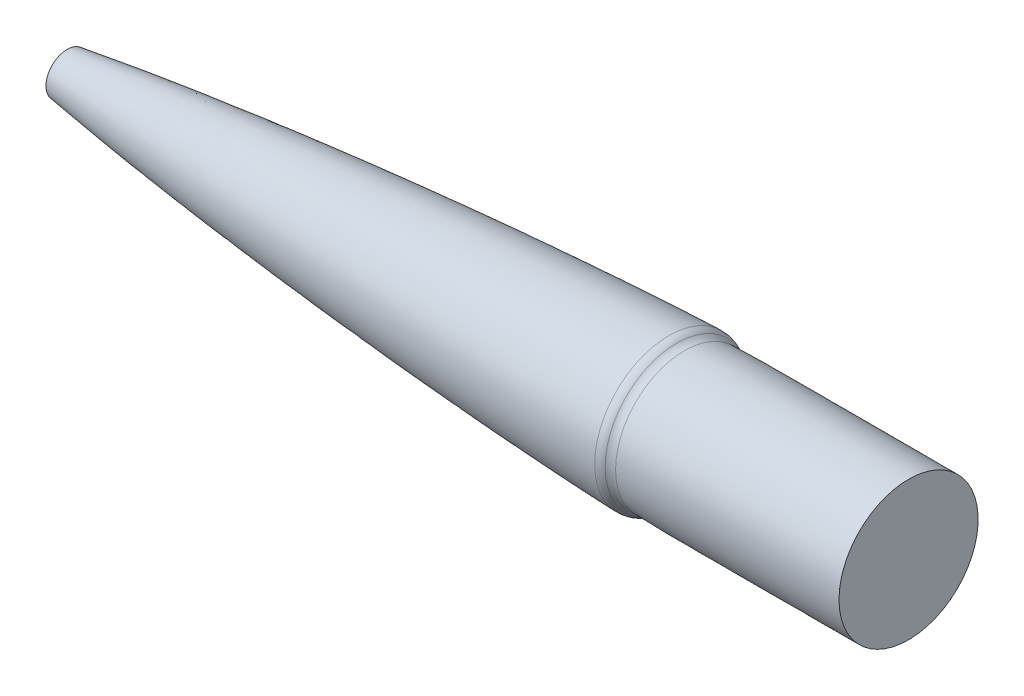
ISO-10303-21;
HEADER;
FILE_DESCRIPTION(('STEP AP214'),'2;1');
FILE_NAME('part.step','',(''),(''),'','','');
FILE_SCHEMA(('AUTOMOTIVE_DESIGN { 1 0 10303 214 1 1 1 1 }'));
ENDSEC;
DATA;
#1=APPLICATION_CONTEXT('core data for automotive mechanical design processes');
#2=APPLICATION_PROTOCOL_DEFINITION('international standard','automotive_design',2000,#1);
#3=PRODUCT_CONTEXT('',#1,'mechanical');
#4=PRODUCT('Part','Part','',(#3));
#5=PRODUCT_RELATED_PRODUCT_CATEGORY('part','',(#4));
#6=PRODUCT_DEFINITION_FORMATION('','',#4);
#7=PRODUCT_DEFINITION_CONTEXT('part definition',#1,'design');
#8=PRODUCT_DEFINITION('design','',#6,#7);
#9=PRODUCT_DEFINITION_SHAPE('','',#8);
#10=(LENGTH_UNIT() NAMED_UNIT(*) SI_UNIT(.MILLI.,.METRE.));
#11=(NAMED_UNIT(*) PLANE_ANGLE_UNIT() SI_UNIT($,.RADIAN.));
#12=(NAMED_UNIT(*) SI_UNIT($,.STERADIAN.) SOLID_ANGLE_UNIT());
#13=UNCERTAINTY_MEASURE_WITH_UNIT(LENGTH_MEASURE(1.E-05),#10,'distance_accuracy_value','');
#14=(GEOMETRIC_REPRESENTATION_CONTEXT(3) GLOBAL_UNCERTAINTY_ASSIGNED_CONTEXT((#13)) GLOBAL_UNIT_ASSIGNED_CONTEXT((#10,
#11,#12)) REPRESENTATION_CONTEXT('',''));
#15=CARTESIAN_POINT('',(0.,0.,0.));
#16=DIRECTION('',(0.,0.,1.));
#17=DIRECTION('',(1.,0.,0.));
#18=AXIS2_PLACEMENT_3D('',#15,#16,#17);
#19=CARTESIAN_POINT('',(4.83268455642582,0.,6.60552318193741));
#20=CARTESIAN_POINT('',(4.83749972097028,0.,6.60285947370063));
#21=CARTESIAN_POINT('',(4.82681383787675,0.,6.60876016188589));
#22=CARTESIAN_POINT('',(4.83801886693308,0.,6.60257668329158));
#23=CARTESIAN_POINT('',(4.83250618312896,0.,6.60561165797518));
#24=CARTESIAN_POINT('',(4.8399846110203,0.,6.60150461279268));
#25=CARTESIAN_POINT('',(4.83520410508804,0.,6.60412357297985));
#26=CARTESIAN_POINT('',(4.8464347391894,0.,6.59798672188499));
#27=CARTESIAN_POINT('',(4.83896554863311,0.,6.60204769683206));
#28=CARTESIAN_POINT('',(4.8539759734831,0.,6.59393191213478));
#29=CARTESIAN_POINT('',(4.84911899118824,0.,6.59654394521379));
#30=CARTESIAN_POINT('',(4.8641679427654,0.,6.58849982488547));
#31=CARTESIAN_POINT('',(4.86170750840961,0.,6.58980766712842));
#32=CARTESIAN_POINT('',(4.87679746030247,0.,6.58184072497347));
#33=CARTESIAN_POINT('',(4.87651514125029,0.,6.58198934907074));
#34=CARTESIAN_POINT('',(4.89921559976168,0.,6.57016388848399));
#35=CARTESIAN_POINT('',(4.90432341538071,0.,6.56755835116335));
#36=CARTESIAN_POINT('',(4.93475704207706,0.,6.55211459424268));
#37=CARTESIAN_POINT('',(4.94623689867739,0.,6.54635949091499));
#38=CARTESIAN_POINT('',(4.97679775161726,0.,6.53116904887707));
#39=CARTESIAN_POINT('',(4.99342554287252,0.,6.52298709115691));
#40=CARTESIAN_POINT('',(5.02409890874871,0.,6.50802514317069));
#41=CARTESIAN_POINT('',(5.044659359757,0.,6.49809059549946));
#42=CARTESIAN_POINT('',(5.07544018073853,0.,6.48335097808854));
#43=CARTESIAN_POINT('',(5.09885600542887,0.,6.47223965954034));
#44=CARTESIAN_POINT('',(5.12973367847781,0.,6.45770402853244));
#45=CARTESIAN_POINT('',(5.15537548823818,0.,6.44572972430582));
#46=CARTESIAN_POINT('',(5.18633782369174,0.,6.43137531575032));
#47=CARTESIAN_POINT('',(5.21368121334199,0.,6.41879007529082));
#48=CARTESIAN_POINT('',(5.2447189993178,0.,6.40459954663838));
#49=CARTESIAN_POINT('',(5.27324287392851,0.,6.39164454267426));
#50=CARTESIAN_POINT('',(5.30434899961548,0.,6.37760444985172));
#51=CARTESIAN_POINT('',(5.33354110646858,0.,6.36450914158684));
#52=CARTESIAN_POINT('',(5.36470997323617,0.,6.35060888956967));
#53=CARTESIAN_POINT('',(5.39407170494003,0.,6.33759006005425));
#54=CARTESIAN_POINT('',(5.42529881638663,0.,6.32382115405486));
#55=CARTESIAN_POINT('',(5.45434932394373,0.,6.31108198351092));
#56=CARTESIAN_POINT('',(5.4856309908471,0.,6.29743747628402));
#57=CARTESIAN_POINT('',(5.51391283997896,0.,6.28516624393363));
#58=CARTESIAN_POINT('',(5.54524547882567,0.,6.27163919678282));
#59=CARTESIAN_POINT('',(5.57247956278986,0.,6.25993673000104));
#60=CARTESIAN_POINT('',(5.60385711349994,0.,6.24651419025795));
#61=CARTESIAN_POINT('',(5.62995741615585,0.,6.23539740715504));
#62=CARTESIAN_POINT('',(5.66137589888544,0.,6.22207095959049));
#63=CARTESIAN_POINT('',(5.68627456092169,0.,6.21155229874281));
#64=CARTESIAN_POINT('',(5.71773058102512,0.,6.19831469847049));
#65=CARTESIAN_POINT('',(5.74138407559505,0.,6.18839781700479));
#66=CARTESIAN_POINT('',(5.77287471729874,0.,6.17524278957005));
#67=CARTESIAN_POINT('',(5.79526099537225,0.,6.16592377046405));
#68=CARTESIAN_POINT('',(5.84254511111652,0.,6.14630689667781));
#69=CARTESIAN_POINT('',(5.88352104666606,0.,6.129417198479));
#70=CARTESIAN_POINT('',(5.94668237522017,0.,6.10354235312387));
#71=CARTESIAN_POINT('',(5.98275550140594,0.,6.08885040636339));
#72=CARTESIAN_POINT('',(6.04601925522565,0.,6.0632270088621));
#73=CARTESIAN_POINT('',(6.07756403840755,0.,6.05051854445484));
#74=CARTESIAN_POINT('',(6.14091959540364,0.,6.02512298491023));
#75=CARTESIAN_POINT('',(6.16860262808675,0.,6.01408022182471));
#76=CARTESIAN_POINT('',(6.23204044160335,0.,5.98889084185814));
#77=CARTESIAN_POINT('',(6.25663256825075,0.,5.9791696817537));
#78=CARTESIAN_POINT('',(6.32014522146024,0.,5.9541696031706));
#79=CARTESIAN_POINT('',(6.34245362414577,0.,5.94542518684871));
#80=CARTESIAN_POINT('',(6.40603523176033,0.,5.92060100065827));
#81=CARTESIAN_POINT('',(6.42692097790816,0.,5.91247878693595));
#82=CARTESIAN_POINT('',(6.49056694962166,0.,5.88782009006219));
#83=CARTESIAN_POINT('',(6.51093672045816,0.,5.87995795236834));
#84=CARTESIAN_POINT('',(6.57464357246575,0.,5.85545697169104));
#85=CARTESIAN_POINT('',(6.59544319499273,0.,5.84748694072378));
#86=CARTESIAN_POINT('',(6.65920839624904,0.,5.82313822092973));
#87=CARTESIAN_POINT('',(6.6814162495825,0.,5.81468870758096));
#88=CARTESIAN_POINT('',(6.74523798919747,0.,5.79048857123038));
#89=CARTESIAN_POINT('',(6.76951825878803,0.,5.78131417164714));
#90=CARTESIAN_POINT('',(6.83339493947841,0.,5.75725942760681));
#91=CARTESIAN_POINT('',(6.8596734214108,0.,5.74739783947368));
#92=CARTESIAN_POINT('',(6.95556932930949,0.,5.71153125051222));
#93=CARTESIAN_POINT('',(7.01340753174464,0.,5.69004886411442));
#94=CARTESIAN_POINT('',(7.1414775821322,0.,5.6427888770091));
#95=CARTESIAN_POINT('',(7.20510392805037,0.,5.6194676051386));
#96=CARTESIAN_POINT('',(7.33337270115734,0.,5.57274966390496));
#97=CARTESIAN_POINT('',(7.4012029669081,0.,5.54820463008454));
#98=CARTESIAN_POINT('',(7.59388780681527,0.,5.47890598730019));
#99=CARTESIAN_POINT('',(7.73543883749296,0.,5.42862731186892));
#100=CARTESIAN_POINT('',(7.99303402975234,0.,5.33814806742735));
#101=CARTESIAN_POINT('',(8.13136793124169,0.,5.29009625338913));
#102=CARTESIAN_POINT('',(8.38955131631159,0.,5.20130933755284));
#103=CARTESIAN_POINT('',(8.52061198204528,0.,5.15668382125682));
#104=CARTESIAN_POINT('',(8.90865202682184,0.,5.02574902321967));
#105=CARTESIAN_POINT('',(9.16165698677185,0.,4.94190576947565));
#106=CARTESIAN_POINT('',(9.94029019567608,0.,4.687728042795));
#107=CARTESIAN_POINT('',(10.4608949378079,0.,4.52278983098063));
#108=CARTESIAN_POINT('',(13.0694093427846,0.,3.71666932260896));
#109=CARTESIAN_POINT('',(15.1730596457674,0.,3.12787826699114));
#110=CARTESIAN_POINT('',(21.5041419916135,0.,1.43865959019151));
#111=CARTESIAN_POINT('',(25.7532051724552,0.,0.421026181929159));
#112=CARTESIAN_POINT('',(34.2726824192563,0.,-1.51528134352232));
#113=CARTESIAN_POINT('',(38.5448966370535,0.,-2.42798670810905));
#114=CARTESIAN_POINT('',(47.1027601183387,0.,-4.18689319441429));
#115=CARTESIAN_POINT('',(51.3889242671881,0.,-5.0309718203088));
#116=CARTESIAN_POINT('',(64.2617852835467,0.,-7.48733150188042));
#117=CARTESIAN_POINT('',(72.8629142375998,0.,-9.02313024476923));
#118=CARTESIAN_POINT('',(90.0864300781289,0.,-11.9682312037464));
#119=CARTESIAN_POINT('',(98.7095200342393,0.,-13.3741187408272));
#120=CARTESIAN_POINT('',(124.601188031838,0.,-17.4482496701259));
#121=CARTESIAN_POINT('',(141.891817456551,0.,-19.9748151700434));
#122=CARTESIAN_POINT('',(176.507305156509,0.,-24.7769481923739));
#123=CARTESIAN_POINT('',(193.832729026664,0.,-27.049800159208));
#124=CARTESIAN_POINT('',(245.845180778652,0.,-33.5776574535152));
#125=CARTESIAN_POINT('',(280.56798660515,0.,-37.5442567701871));
#126=CARTESIAN_POINT('',(350.07183031062,0.,-44.9189154908417));
#127=CARTESIAN_POINT('',(384.853733718803,0.,-48.3222362982757));
#128=CARTESIAN_POINT('',(454.461735096074,0.,-54.6385663515796));
#129=CARTESIAN_POINT('',(489.288073765698,0.,-57.5503387899058));
#130=CARTESIAN_POINT('',(558.97765835012,0.,-62.8918443390221));
#131=CARTESIAN_POINT('',(593.840989824159,0.,-65.321984906555));
#132=CARTESIAN_POINT('',(663.601030955245,0.,-69.6470909711167));
#133=CARTESIAN_POINT('',(698.49775323348,0.,-71.5473308312863));
#134=CARTESIAN_POINT('',(750.867293771161,0.,-73.858019468879));
#135=CARTESIAN_POINT('',(768.327894946954,0.,-74.5383123540745));
#136=CARTESIAN_POINT('',(786.330846217041,0.,-75.1061683142761));
#137=CARTESIAN_POINT('',(786.868989785362,0.,-75.1230203611017));
#138=CARTESIAN_POINT('',(787.407137336109,0.,-75.1397468610843));
#139=CARTESIAN_POINT('',(789.769222398439,0.,-75.2131643015221));
#140=CARTESIAN_POINT('',(794.493542884528,0.,-75.3551615513797));
#141=CARTESIAN_POINT('',(801.580357780933,0.,-75.5584829979889));
#142=CARTESIAN_POINT('',(806.30534090121,0.,-75.6762894582134));
#143=CARTESIAN_POINT('',(808.667832461347,0.,-75.7351926883257));
#144=CARTESIAN_POINT('',(812.810288023743,0.,-75.8384751792936));
#145=CARTESIAN_POINT('',(821.095199148533,0.,-76.0450401612293));
#146=CARTESIAN_POINT('',(833.527393301713,0.,-76.2));
#147=CARTESIAN_POINT('',(841.814879135031,0.,-76.2));
#148=CARTESIAN_POINT('',(845.95862205169,0.,-76.2));
#149=CARTESIAN_POINT('',(850.74099737928,0.,-76.2));
#150=CARTESIAN_POINT('',(860.30574803446,0.,-76.2));
#151=CARTESIAN_POINT('',(874.65287401723,0.,-76.2));
#152=CARTESIAN_POINT('',(884.21762467241,0.,-76.2));
#153=CARTESIAN_POINT('',(889.,0.,-76.2));
#154=CARTESIAN_POINT('',(939.8,0.,-76.2));
#155=CARTESIAN_POINT('',(990.6,0.,-76.2));
#156=CARTESIAN_POINT('',(1041.4,0.,-76.2));
#157=B_SPLINE_CURVE_WITH_KNOTS('',3,(#19,#20,#21,#22,#23,#24,#25,#26,#27,#28,#29,#30,#31,#32,
#33,#34,#35,#36,#37,#38,#39,#40,#41,#42,#43,#44,#45,#46,#47,#48,#49,#50,#51,#52,#53,#54,#55,#56,
#57,#58,#59,#60,#61,#62,#63,#64,#65,#66,#67,#68,#69,#70,#71,#72,#73,#74,#75,#76,#77,#78,#79,#80,
#81,#82,#83,#84,#85,#86,#87,#88,#89,#90,#91,#92,#93,#94,#95,#96,#97,#98,#99,#100,#101,#102,#103,
#104,#105,#106,#107,#108,#109,#110,#111,#112,#113,#114,#115,#116,#117,#118,#119,#120,#121,#122,
#123,#124,#125,#126,#127,#128,#129,#130,#131,#132,#133,#134,#135,#136,#137,#138,#139,#140,#141,
#142,#143,#144,#145,#146,#147,#148,#149,#150,#151,#152,#153,#154,#155,#156),.UNSPECIFIED.,.F.,
.F.,(4,2,2,2,2,2,2,2,2,2,2,2,2,2,2,2,2,2,2,2,2,2,2,2,2,2,2,2,2,2,2,2,2,2,2,2,2,2,2,2,2,2,2,2,2,
2,2,2,2,2,2,2,2,2,2,2,2,2,2,3,1,1,3,1,1,3,1,1,3,4),(0.,2.45659755341227E-05,
3.68489633011841E-05,4.91319510682454E-05,7.36979266023682E-05,9.82639021364909E-05,
0.000122829877670614,0.000147395853204736,0.000196527804272982,0.000245659755341227,
0.000294791706409473,0.000343923657477718,0.000393055608545963,0.000442187559614209,
0.000491319510682454,0.0005404514617507,0.000589583412818945,0.000638715363887191,
0.000687847314955436,0.000736979266023681,0.000786111217091927,0.000835243168160172,
0.000884375119228418,0.000933507070296663,0.000982639021364909,0.0010809029235014,
0.00117916682563789,0.00127743072777438,0.00137569462991087,0.00147395853204736,
0.00157222243418385,0.00167048633632034,0.00176875023845684,0.00186701414059333,
0.00196527804272982,0.00206354194486631,0.0021618058470028,0.00235833365127578,
0.00255486145554876,0.00275138925982174,0.00314444486836771,0.00353750047691367,
0.00393055608545964,0.00471666730255156,0.00628888973673541,0.0125777794734708,
0.0251555589469417,0.0377333384204125,0.0503111178938833,0.075466676840825,0.100622235787767,
0.15093335368165,0.201244471575533,0.3018667073633,0.402488943151067,0.503111178938833,
0.6037334147266,0.704355650514367,0.75466676840825,0.756216994376473,0.763021383986146,
0.769825773595819,0.776630163205491,0.788561160997351,0.80049215878921,0.812423156581069,
0.826192956161041,0.839962755741013,0.853732555320985,1.),.UNSPECIFIED.);
#158=CARTESIAN_POINT('',(0.,0.,0.));
#159=DIRECTION('',(-1.,0.,0.));
#160=AXIS1_PLACEMENT('',#158,#159);
#161=SURFACE_OF_REVOLUTION('',#157,#160);
#162=CARTESIAN_POINT('',(1041.4,0.,0.));
#163=DIRECTION('',(-1.,0.,0.));
#164=DIRECTION('',(0.,0.,1.));
#165=AXIS2_PLACEMENT_3D('',#162,#163,#164);
#166=CIRCLE('',#165,76.2);
#167=CARTESIAN_POINT('',(1041.4,0.,76.2));
#168=VERTEX_POINT('',#167);
#169=EDGE_CURVE('E53',#168,#168,#166,.T.);
#170=ORIENTED_EDGE('',*,*,#169,.T.);
#171=EDGE_LOOP('',(#170));
#172=FACE_BOUND('',#171,.T.);
#173=CARTESIAN_POINT('',(795.868589895676,0.,0.));
#174=DIRECTION('',(-1.,0.,0.));
#175=DIRECTION('',(0.,0.,1.));
#176=AXIS2_PLACEMENT_3D('',#173,#174,#175);
#177=CIRCLE('',#176,75.3937343472756);
#178=CARTESIAN_POINT('',(795.868589895676,0.,75.3937343472756));
#179=VERTEX_POINT('',#178);
#180=EDGE_CURVE('E10',#179,#179,#177,.T.);
#181=ORIENTED_EDGE('',*,*,#180,.F.);
#182=EDGE_LOOP('',(#181));
#183=FACE_BOUND('',#182,.T.);
#184=ADVANCED_FACE('F33',(#172,#183),#161,.F.);
#185=CARTESIAN_POINT('',(795.499642950915,0.,0.));
#186=DIRECTION('',(-1.,0.,0.));
#187=DIRECTION('',(0.,0.,1.));
#188=AXIS2_PLACEMENT_3D('',#185,#186,#187);
#189=TOROIDAL_SURFACE('',#188,88.0883740882039,12.7000000000002);
#190=CARTESIAN_POINT('',(787.4,0.,0.));
#191=DIRECTION('',(-1.,0.,0.));
#192=DIRECTION('',(0.,0.,1.));
#193=AXIS2_PLACEMENT_3D('',#190,#191,#192);
#194=CIRCLE('',#193,78.3064630240148);
#195=CARTESIAN_POINT('',(787.4,0.,78.3064630240148));
#196=VERTEX_POINT('',#195);
#197=EDGE_CURVE('E40',#196,#196,#194,.T.);
#198=ORIENTED_EDGE('',*,*,#197,.F.);
#199=EDGE_LOOP('',(#198));
#200=FACE_BOUND('',#199,.T.);
#201=ORIENTED_EDGE('',*,*,#180,.T.);
#202=EDGE_LOOP('',(#201));
#203=FACE_BOUND('',#202,.T.);
#204=ADVANCED_FACE('F75',(#200,#203),#189,.F.);
#205=CARTESIAN_POINT('',(779.300357049086,0.,0.));
#206=DIRECTION('',(-1.,0.,0.));
#207=DIRECTION('',(0.,0.,1.));
#208=AXIS2_PLACEMENT_3D('',#205,#206,#207);
#209=TOROIDAL_SURFACE('',#208,68.5245519598254,12.7000000000002);
#210=ORIENTED_EDGE('',*,*,#197,.T.);
#211=EDGE_LOOP('',(#210));
#212=FACE_BOUND('',#211,.T.);
#213=CARTESIAN_POINT('',(778.875735907474,0.,0.));
#214=DIRECTION('',(-1.,0.,0.));
#215=DIRECTION('',(0.,0.,1.));
#216=AXIS2_PLACEMENT_3D('',#213,#214,#215);
#217=CIRCLE('',#216,81.2174514270906);
#218=CARTESIAN_POINT('',(778.875735907474,0.,81.2174514270906));
#219=VERTEX_POINT('',#218);
#220=EDGE_CURVE('E44',#219,#219,#217,.T.);
#221=ORIENTED_EDGE('',*,*,#220,.F.);
#222=EDGE_LOOP('',(#221));
#223=FACE_BOUND('',#222,.T.);
#224=ADVANCED_FACE('F71',(#212,#223),#209,.T.);
#225=CARTESIAN_POINT('',(1.45244842624921,0.,1.23264697666696));
#226=CARTESIAN_POINT('',(1.52882645439852,0.,1.18155010634796));
#227=CARTESIAN_POINT('',(1.67309054241462,0.,1.09479404995592));
#228=CARTESIAN_POINT('',(2.07893103489429,0.,0.875013099928082));
#229=CARTESIAN_POINT('',(2.62828038979555,0.,0.613724478137329));
#230=CARTESIAN_POINT('',(3.29019119701565,0.,0.32753611217494));
#231=CARTESIAN_POINT('',(3.84927139704919,0.,0.101471997255759));
#232=CARTESIAN_POINT('',(4.58305576925838,0.,-0.183876692202146));
#233=CARTESIAN_POINT('',(5.62531865421944,0.,-0.566314390544476));
#234=CARTESIAN_POINT('',(7.57361675674083,0.,-1.23102021959136));
#235=CARTESIAN_POINT('',(10.1540882156573,0.,-2.03601613698555));
#236=CARTESIAN_POINT('',(14.3306902511786,0.,-3.23639031913265));
#237=CARTESIAN_POINT('',(19.606120623133,0.,-4.61635813418839));
#238=CARTESIAN_POINT('',(25.9823729240471,0.,-6.15158658413236));
#239=CARTESIAN_POINT('',(32.3864369799119,0.,-7.59611973859471));
#240=CARTESIAN_POINT('',(40.9537795060795,0.,-9.42837869282166));
#241=CARTESIAN_POINT('',(51.6994376349832,0.,-11.5795806755008));
#242=CARTESIAN_POINT('',(64.632948511903,0.,-13.9971071100497));
#243=CARTESIAN_POINT('',(77.5936256929044,0.,-16.2896409179459));
#244=CARTESIAN_POINT('',(90.5746120795872,0.,-18.4783586125551));
#245=CARTESIAN_POINT('',(107.90513751837,0.,-21.2786328028619));
#246=CARTESIAN_POINT('',(129.601911643364,0.,-24.5916998906359));
#247=CARTESIAN_POINT('',(155.676122735182,0.,-28.3306648676024));
#248=CARTESIAN_POINT('',(181.780624308129,0.,-31.8710588851814));
#249=CARTESIAN_POINT('',(207.909316089286,0.,-35.2410998528516));
#250=CARTESIAN_POINT('',(234.058183470076,0.,-38.4608454567614));
#251=CARTESIAN_POINT('',(268.946365385981,0.,-42.572514826731));
#252=CARTESIAN_POINT('',(312.594336759653,0.,-47.4009379276722));
#253=CARTESIAN_POINT('',(365.019685973044,0.,-52.7606502047852));
#254=CARTESIAN_POINT('',(417.485255262941,0.,-57.7223011110558));
#255=CARTESIAN_POINT('',(469.985513157308,0.,-62.3083173520217));
#256=CARTESIAN_POINT('',(540.027082024871,0.,-67.9331237269786));
#257=CARTESIAN_POINT('',(610.124542731448,0.,-72.8280435060441));
#258=CARTESIAN_POINT('',(680.269983383821,0.,-76.9112446621285));
#259=CARTESIAN_POINT('',(724.129737671066,0.,-79.080505645521));
#260=CARTESIAN_POINT('',(759.227248844478,0.,-80.5377036730948));
#261=CARTESIAN_POINT('',(778.251825867424,0.,-81.2092800396818));
#262=CARTESIAN_POINT('',(788.500335390764,0.,-81.527068120762));
#263=CARTESIAN_POINT('',(789.97282713585,0.,-81.5717388323561));
#264=CARTESIAN_POINT('',(792.218857310202,0.,-81.6398762371904));
#265=CARTESIAN_POINT('',(796.711057091189,0.,-81.7715549058981));
#266=CARTESIAN_POINT('',(803.4496673757,0.,-81.9598813951358));
#267=CARTESIAN_POINT('',(807.942479666771,0.,-82.0685769210198));
#268=CARTESIAN_POINT('',(810.188885812307,0.,-82.1229246839617));
#269=CARTESIAN_POINT('',(814.111364387871,0.,-82.2178220097162));
#270=CARTESIAN_POINT('',(821.956321539,0.,-82.4076166612252));
#271=CARTESIAN_POINT('',(833.728061292409,0.,-82.5499940518676));
#272=CARTESIAN_POINT('',(841.575313978081,0.,-82.5499942766283));
#273=CARTESIAN_POINT('',(845.498940320917,0.,-82.5499943890087));
#274=CARTESIAN_POINT('',(850.050169175283,0.,-82.5499945193648));
#275=CARTESIAN_POINT('',(859.152626884014,0.,-82.549994780077));
#276=CARTESIAN_POINT('',(872.80631344711,0.,-82.5499951711454));
#277=CARTESIAN_POINT('',(881.908771155841,0.,-82.5499954318577));
#278=CARTESIAN_POINT('',(886.460000010207,0.,-82.5499955622138));
#279=CARTESIAN_POINT('',(938.106666673471,0.,-82.5499970414757));
#280=CARTESIAN_POINT('',(989.753333336736,0.,-82.5499985207376));
#281=CARTESIAN_POINT('',(1041.4,0.,-82.5499999999996));
#282=B_SPLINE_CURVE_WITH_KNOTS('',3,(#225,#226,#227,#228,#229,#230,#231,#232,#233,#234,#235,
#236,#237,#238,#239,#240,#241,#242,#243,#244,#245,#246,#247,#248,#249,#250,#251,#252,#253,#254,
#255,#256,#257,#258,#259,#260,#261,#262,#263,#264,#265,#266,#267,#268,#269,#270,#271,#272,#273,
#274,#275,#276,#277,#278,#279,#280,#281),.UNSPECIFIED.,.F.,.F.,(4,1,1,1,1,1,1,1,1,1,1,1,1,1,1,1,
1,1,1,1,1,1,1,1,1,1,1,1,1,1,1,1,1,1,1,1,3,1,1,3,1,1,3,1,1,3,4),(0.,0.000393442933372629,
0.000786885866745257,0.00157377173349051,0.00236065760023577,0.00300430995788763,
0.00339775289126026,0.00472131520047154,0.00629508693396205,0.00944263040094308,
0.0125901738679241,0.0188852608018862,0.0251803477358482,0.0314754346698103,0.0377705216037723,
0.0503606954716964,0.0629508693396205,0.0755410432075447,0.0881312170754688,0.100721390943393,
0.125901738679241,0.151082086415089,0.176262434150938,0.201442781886786,0.226623129622634,
0.251803477358482,0.302164172830179,0.352524868301875,0.402885563773571,0.453246259245268,
0.503606954716964,0.604328345660357,0.654689041132054,0.70504973660375,0.730230084339598,
0.755410432075447,0.759635317002295,0.766079644490401,0.772523971978508,0.778968299466614,
0.790220822326853,0.801473345187091,0.81272586804733,0.825778284931886,0.838830701816443,
0.851883118700999,1.),.UNSPECIFIED.);
#283=CARTESIAN_POINT('',(0.,0.,0.));
#284=DIRECTION('',(-1.,0.,0.));
#285=AXIS1_PLACEMENT('',#283,#284);
#286=SURFACE_OF_REVOLUTION('',#282,#285);
#287=ORIENTED_EDGE('',*,*,#220,.T.);
#288=EDGE_LOOP('',(#287));
#289=FACE_BOUND('',#288,.T.);
#290=CARTESIAN_POINT('',(119.6848,0.,0.));
#291=DIRECTION('',(-1.,0.,0.));
#292=DIRECTION('',(0.,0.,1.));
#293=AXIS2_PLACEMENT_3D('',#290,#291,#292);
#294=CIRCLE('',#293,23.0649453809158);
#295=CARTESIAN_POINT('',(119.6848,0.,23.0649453809158));
#296=VERTEX_POINT('',#295);
#297=EDGE_CURVE('E48',#296,#296,#294,.T.);
#298=ORIENTED_EDGE('',*,*,#297,.F.);
#299=EDGE_LOOP('',(#298));
#300=FACE_BOUND('',#299,.T.);
#301=ADVANCED_FACE('F66',(#289,#300),#286,.F.);
#302=CARTESIAN_POINT('',(119.6848,0.,0.));
#303=DIRECTION('',(1.,0.,0.));
#304=DIRECTION('',(0.,0.,-1.));
#305=AXIS2_PLACEMENT_3D('',#302,#303,#304);
#306=PLANE('',#305);
#307=ORIENTED_EDGE('',*,*,#297,.T.);
#308=EDGE_LOOP('',(#307));
#309=FACE_BOUND('',#308,.T.);
#310=ADVANCED_FACE('F70',(#309),#306,.F.);
#311=CARTESIAN_POINT('',(1041.4,0.,0.));
#312=DIRECTION('',(-1.,0.,0.));
#313=DIRECTION('',(0.,0.,1.));
#314=AXIS2_PLACEMENT_3D('',#311,#312,#313);
#315=PLANE('',#314);
#316=ORIENTED_EDGE('',*,*,#169,.F.);
#317=EDGE_LOOP('',(#316));
#318=FACE_BOUND('',#317,.T.);
#319=ADVANCED_FACE('F87',(#318),#315,.F.);
#320=CLOSED_SHELL('',(#184,#204,#224,#301,#310,#319));
#321=MANIFOLD_SOLID_BREP('B2',#320);
#322=ADVANCED_BREP_SHAPE_REPRESENTATION('',(#18,#321),#14);
#323=SHAPE_DEFINITION_REPRESENTATION(#9,#322);
ENDSEC;
END-ISO-10303-21;
